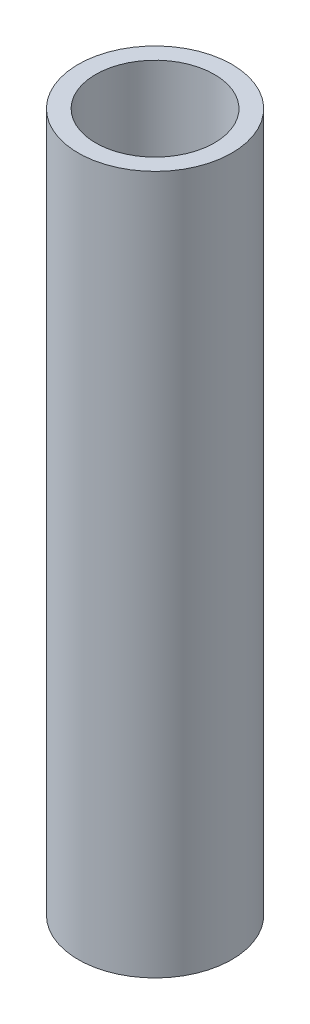
ISO-10303-21;
HEADER;
FILE_DESCRIPTION(('STEP AP214'),'2;1');
FILE_NAME('part.step','',(''),(''),'','','');
FILE_SCHEMA(('AUTOMOTIVE_DESIGN { 1 0 10303 214 1 1 1 1 }'));
ENDSEC;
DATA;
#1=APPLICATION_CONTEXT('core data for automotive mechanical design processes');
#2=APPLICATION_PROTOCOL_DEFINITION('international standard','automotive_design',2000,#1);
#3=PRODUCT_CONTEXT('',#1,'mechanical');
#4=PRODUCT('Part','Part','',(#3));
#5=PRODUCT_RELATED_PRODUCT_CATEGORY('part','',(#4));
#6=PRODUCT_DEFINITION_FORMATION('','',#4);
#7=PRODUCT_DEFINITION_CONTEXT('part definition',#1,'design');
#8=PRODUCT_DEFINITION('design','',#6,#7);
#9=PRODUCT_DEFINITION_SHAPE('','',#8);
#10=(LENGTH_UNIT() NAMED_UNIT(*) SI_UNIT(.MILLI.,.METRE.));
#11=(NAMED_UNIT(*) PLANE_ANGLE_UNIT() SI_UNIT($,.RADIAN.));
#12=(NAMED_UNIT(*) SI_UNIT($,.STERADIAN.) SOLID_ANGLE_UNIT());
#13=UNCERTAINTY_MEASURE_WITH_UNIT(LENGTH_MEASURE(1.E-05),#10,'distance_accuracy_value','');
#14=(GEOMETRIC_REPRESENTATION_CONTEXT(3) GLOBAL_UNCERTAINTY_ASSIGNED_CONTEXT((#13)) GLOBAL_UNIT_ASSIGNED_CONTEXT((#10,
#11,#12)) REPRESENTATION_CONTEXT('',''));
#15=CARTESIAN_POINT('',(0.,0.,0.));
#16=DIRECTION('',(0.,0.,1.));
#17=DIRECTION('',(1.,0.,0.));
#18=AXIS2_PLACEMENT_3D('',#15,#16,#17);
#19=CARTESIAN_POINT('',(0.,152.4,0.));
#20=DIRECTION('',(0.,1.,0.));
#21=DIRECTION('',(0.,0.,1.));
#22=AXIS2_PLACEMENT_3D('',#19,#20,#21);
#23=PLANE('',#22);
#24=CARTESIAN_POINT('',(0.,152.4,0.));
#25=DIRECTION('',(0.,1.,0.));
#26=DIRECTION('',(0.,0.,1.));
#27=AXIS2_PLACEMENT_3D('',#24,#25,#26);
#28=CIRCLE('',#27,16.764);
#29=CARTESIAN_POINT('',(0.,152.4,-16.764));
#30=VERTEX_POINT('',#29);
#31=EDGE_CURVE('E10',#30,#30,#28,.T.);
#32=ORIENTED_EDGE('',*,*,#31,.T.);
#33=EDGE_LOOP('',(#32));
#34=FACE_BOUND('',#33,.T.);
#35=CARTESIAN_POINT('',(0.,152.4,0.));
#36=DIRECTION('',(0.,1.,0.));
#37=DIRECTION('',(0.,0.,1.));
#38=AXIS2_PLACEMENT_3D('',#35,#36,#37);
#39=CIRCLE('',#38,12.954);
#40=CARTESIAN_POINT('',(0.,152.4,-12.954));
#41=VERTEX_POINT('',#40);
#42=EDGE_CURVE('E43',#41,#41,#39,.T.);
#43=ORIENTED_EDGE('',*,*,#42,.F.);
#44=EDGE_LOOP('',(#43));
#45=FACE_BOUND('',#44,.T.);
#46=ADVANCED_FACE('F32',(#34,#45),#23,.T.);
#47=CARTESIAN_POINT('',(0.,0.,0.));
#48=DIRECTION('',(0.,1.,0.));
#49=DIRECTION('',(0.,0.,1.));
#50=AXIS2_PLACEMENT_3D('',#47,#48,#49);
#51=PLANE('',#50);
#52=CARTESIAN_POINT('',(0.,0.,0.));
#53=DIRECTION('',(0.,1.,0.));
#54=DIRECTION('',(0.,0.,1.));
#55=AXIS2_PLACEMENT_3D('',#52,#53,#54);
#56=CIRCLE('',#55,16.764);
#57=CARTESIAN_POINT('',(0.,0.,-16.764));
#58=VERTEX_POINT('',#57);
#59=EDGE_CURVE('E36',#58,#58,#56,.T.);
#60=ORIENTED_EDGE('',*,*,#59,.F.);
#61=EDGE_LOOP('',(#60));
#62=FACE_BOUND('',#61,.T.);
#63=CARTESIAN_POINT('',(0.,0.,0.));
#64=DIRECTION('',(0.,1.,0.));
#65=DIRECTION('',(0.,0.,1.));
#66=AXIS2_PLACEMENT_3D('',#63,#64,#65);
#67=CIRCLE('',#66,12.954);
#68=CARTESIAN_POINT('',(0.,0.,-12.954));
#69=VERTEX_POINT('',#68);
#70=EDGE_CURVE('E45',#69,#69,#67,.T.);
#71=ORIENTED_EDGE('',*,*,#70,.T.);
#72=EDGE_LOOP('',(#71));
#73=FACE_BOUND('',#72,.T.);
#74=ADVANCED_FACE('F55',(#62,#73),#51,.F.);
#75=CARTESIAN_POINT('',(0.,152.4,0.));
#76=DIRECTION('',(0.,-1.,0.));
#77=DIRECTION('',(0.,0.,-1.));
#78=AXIS2_PLACEMENT_3D('',#75,#76,#77);
#79=CYLINDRICAL_SURFACE('',#78,16.764);
#80=CARTESIAN_POINT('',(0.,152.4,-16.764));
#81=CARTESIAN_POINT('',(0.,150.8125,-16.764));
#82=CARTESIAN_POINT('',(0.,149.225,-16.764));
#83=CARTESIAN_POINT('',(0.,146.05,-16.764));
#84=CARTESIAN_POINT('',(0.,144.4625,-16.764));
#85=CARTESIAN_POINT('',(0.,141.2875,-16.764));
#86=CARTESIAN_POINT('',(0.,139.7,-16.764));
#87=CARTESIAN_POINT('',(0.,136.525,-16.764));
#88=CARTESIAN_POINT('',(0.,134.9375,-16.764));
#89=CARTESIAN_POINT('',(0.,131.7625,-16.764));
#90=CARTESIAN_POINT('',(0.,130.175,-16.764));
#91=CARTESIAN_POINT('',(0.,127.,-16.764));
#92=CARTESIAN_POINT('',(0.,125.4125,-16.764));
#93=CARTESIAN_POINT('',(0.,122.2375,-16.764));
#94=CARTESIAN_POINT('',(0.,120.65,-16.764));
#95=CARTESIAN_POINT('',(0.,117.475,-16.764));
#96=CARTESIAN_POINT('',(0.,115.8875,-16.764));
#97=CARTESIAN_POINT('',(0.,112.7125,-16.764));
#98=CARTESIAN_POINT('',(0.,111.125,-16.764));
#99=CARTESIAN_POINT('',(0.,107.95,-16.764));
#100=CARTESIAN_POINT('',(0.,106.3625,-16.764));
#101=CARTESIAN_POINT('',(0.,103.1875,-16.764));
#102=CARTESIAN_POINT('',(0.,101.6,-16.764));
#103=CARTESIAN_POINT('',(0.,98.425,-16.764));
#104=CARTESIAN_POINT('',(0.,96.8375,-16.764));
#105=CARTESIAN_POINT('',(0.,93.6625,-16.764));
#106=CARTESIAN_POINT('',(0.,92.075,-16.764));
#107=CARTESIAN_POINT('',(0.,88.9,-16.764));
#108=CARTESIAN_POINT('',(0.,87.3125,-16.764));
#109=CARTESIAN_POINT('',(0.,84.1375,-16.764));
#110=CARTESIAN_POINT('',(0.,82.55,-16.764));
#111=CARTESIAN_POINT('',(0.,79.375,-16.764));
#112=CARTESIAN_POINT('',(0.,77.7875,-16.764));
#113=CARTESIAN_POINT('',(0.,74.6125,-16.764));
#114=CARTESIAN_POINT('',(0.,73.025,-16.764));
#115=CARTESIAN_POINT('',(0.,69.85,-16.764));
#116=CARTESIAN_POINT('',(0.,68.2625,-16.764));
#117=CARTESIAN_POINT('',(0.,65.0875,-16.764));
#118=CARTESIAN_POINT('',(0.,63.5,-16.764));
#119=CARTESIAN_POINT('',(0.,60.325,-16.764));
#120=CARTESIAN_POINT('',(0.,58.7375,-16.764));
#121=CARTESIAN_POINT('',(0.,55.5625,-16.764));
#122=CARTESIAN_POINT('',(0.,53.975,-16.764));
#123=CARTESIAN_POINT('',(0.,50.8,-16.764));
#124=CARTESIAN_POINT('',(0.,49.2125,-16.764));
#125=CARTESIAN_POINT('',(0.,46.0375,-16.764));
#126=CARTESIAN_POINT('',(0.,44.45,-16.764));
#127=CARTESIAN_POINT('',(0.,41.275,-16.764));
#128=CARTESIAN_POINT('',(0.,39.6875,-16.764));
#129=CARTESIAN_POINT('',(0.,36.5125,-16.764));
#130=CARTESIAN_POINT('',(0.,34.925,-16.764));
#131=CARTESIAN_POINT('',(0.,31.75,-16.764));
#132=CARTESIAN_POINT('',(0.,30.1625,-16.764));
#133=CARTESIAN_POINT('',(0.,26.9875,-16.764));
#134=CARTESIAN_POINT('',(0.,25.4,-16.764));
#135=CARTESIAN_POINT('',(0.,22.225,-16.764));
#136=CARTESIAN_POINT('',(0.,20.6375,-16.764));
#137=CARTESIAN_POINT('',(0.,17.4625,-16.764));
#138=CARTESIAN_POINT('',(0.,15.875,-16.764));
#139=CARTESIAN_POINT('',(0.,12.7,-16.764));
#140=CARTESIAN_POINT('',(0.,11.1125,-16.764));
#141=CARTESIAN_POINT('',(0.,7.93750000000001,-16.764));
#142=CARTESIAN_POINT('',(0.,6.35,-16.764));
#143=CARTESIAN_POINT('',(0.,3.175,-16.764));
#144=CARTESIAN_POINT('',(0.,1.5875,-16.764));
#145=CARTESIAN_POINT('',(0.,0.,-16.764));
#146=B_SPLINE_CURVE_WITH_KNOTS('',3,(#80,#81,#82,#83,#84,#85,#86,#87,#88,#89,#90,#91,#92,#93,
#94,#95,#96,#97,#98,#99,#100,#101,#102,#103,#104,#105,#106,#107,#108,#109,#110,#111,#112,#113,
#114,#115,#116,#117,#118,#119,#120,#121,#122,#123,#124,#125,#126,#127,#128,#129,#130,#131,#132,
#133,#134,#135,#136,#137,#138,#139,#140,#141,#142,#143,#144,#145),.UNSPECIFIED.,.F.,.F.,(4,2,2,
2,2,2,2,2,2,2,2,2,2,2,2,2,2,2,2,2,2,2,2,2,2,2,2,2,2,2,2,2,4),(0.,4.7625,9.52500000000001,
14.2875,19.05,23.8125,28.575,33.3375,38.1,42.8625,47.625,52.3875,57.15,61.9125,66.675,71.4375,
76.2,80.9625,85.725,90.4875,95.25,100.0125,104.775,109.5375,114.3,119.0625,123.825,128.5875,
133.35,138.1125,142.875,147.6375,152.4),.UNSPECIFIED.);
#147=EDGE_CURVE('BSEAM34',#30,#58,#146,.T.);
#148=ORIENTED_EDGE('',*,*,#31,.F.);
#149=ORIENTED_EDGE('',*,*,#59,.T.);
#150=ORIENTED_EDGE('',*,*,#147,.T.);
#151=ORIENTED_EDGE('',*,*,#147,.F.);
#152=EDGE_LOOP('',(#148,#150,#149,#151));
#153=FACE_BOUND('',#152,.T.);
#154=ADVANCED_FACE('F34',(#153),#79,.T.);
#155=CARTESIAN_POINT('',(0.,152.4,0.));
#156=DIRECTION('',(0.,-1.,0.));
#157=DIRECTION('',(0.,0.,-1.));
#158=AXIS2_PLACEMENT_3D('',#155,#156,#157);
#159=CYLINDRICAL_SURFACE('',#158,12.954);
#160=CARTESIAN_POINT('',(0.,152.4,-12.954));
#161=CARTESIAN_POINT('',(0.,150.8125,-12.954));
#162=CARTESIAN_POINT('',(0.,149.225,-12.954));
#163=CARTESIAN_POINT('',(0.,146.05,-12.954));
#164=CARTESIAN_POINT('',(0.,144.4625,-12.954));
#165=CARTESIAN_POINT('',(0.,141.2875,-12.954));
#166=CARTESIAN_POINT('',(0.,139.7,-12.954));
#167=CARTESIAN_POINT('',(0.,136.525,-12.954));
#168=CARTESIAN_POINT('',(0.,134.9375,-12.954));
#169=CARTESIAN_POINT('',(0.,131.7625,-12.954));
#170=CARTESIAN_POINT('',(0.,130.175,-12.954));
#171=CARTESIAN_POINT('',(0.,127.,-12.954));
#172=CARTESIAN_POINT('',(0.,125.4125,-12.954));
#173=CARTESIAN_POINT('',(0.,122.2375,-12.954));
#174=CARTESIAN_POINT('',(0.,120.65,-12.954));
#175=CARTESIAN_POINT('',(0.,117.475,-12.954));
#176=CARTESIAN_POINT('',(0.,115.8875,-12.954));
#177=CARTESIAN_POINT('',(0.,112.7125,-12.954));
#178=CARTESIAN_POINT('',(0.,111.125,-12.954));
#179=CARTESIAN_POINT('',(0.,107.95,-12.954));
#180=CARTESIAN_POINT('',(0.,106.3625,-12.954));
#181=CARTESIAN_POINT('',(0.,103.1875,-12.954));
#182=CARTESIAN_POINT('',(0.,101.6,-12.954));
#183=CARTESIAN_POINT('',(0.,98.425,-12.954));
#184=CARTESIAN_POINT('',(0.,96.8375,-12.954));
#185=CARTESIAN_POINT('',(0.,93.6625,-12.954));
#186=CARTESIAN_POINT('',(0.,92.075,-12.954));
#187=CARTESIAN_POINT('',(0.,88.9,-12.954));
#188=CARTESIAN_POINT('',(0.,87.3125,-12.954));
#189=CARTESIAN_POINT('',(0.,84.1375,-12.954));
#190=CARTESIAN_POINT('',(0.,82.55,-12.954));
#191=CARTESIAN_POINT('',(0.,79.375,-12.954));
#192=CARTESIAN_POINT('',(0.,77.7875,-12.954));
#193=CARTESIAN_POINT('',(0.,74.6125,-12.954));
#194=CARTESIAN_POINT('',(0.,73.025,-12.954));
#195=CARTESIAN_POINT('',(0.,69.85,-12.954));
#196=CARTESIAN_POINT('',(0.,68.2625,-12.954));
#197=CARTESIAN_POINT('',(0.,65.0875,-12.954));
#198=CARTESIAN_POINT('',(0.,63.5,-12.954));
#199=CARTESIAN_POINT('',(0.,60.325,-12.954));
#200=CARTESIAN_POINT('',(0.,58.7375,-12.954));
#201=CARTESIAN_POINT('',(0.,55.5625,-12.954));
#202=CARTESIAN_POINT('',(0.,53.975,-12.954));
#203=CARTESIAN_POINT('',(0.,50.8,-12.954));
#204=CARTESIAN_POINT('',(0.,49.2125,-12.954));
#205=CARTESIAN_POINT('',(0.,46.0375,-12.954));
#206=CARTESIAN_POINT('',(0.,44.45,-12.954));
#207=CARTESIAN_POINT('',(0.,41.275,-12.954));
#208=CARTESIAN_POINT('',(0.,39.6875,-12.954));
#209=CARTESIAN_POINT('',(0.,36.5125,-12.954));
#210=CARTESIAN_POINT('',(0.,34.925,-12.954));
#211=CARTESIAN_POINT('',(0.,31.75,-12.954));
#212=CARTESIAN_POINT('',(0.,30.1625,-12.954));
#213=CARTESIAN_POINT('',(0.,26.9875,-12.954));
#214=CARTESIAN_POINT('',(0.,25.4,-12.954));
#215=CARTESIAN_POINT('',(0.,22.225,-12.954));
#216=CARTESIAN_POINT('',(0.,20.6375,-12.954));
#217=CARTESIAN_POINT('',(0.,17.4625,-12.954));
#218=CARTESIAN_POINT('',(0.,15.875,-12.954));
#219=CARTESIAN_POINT('',(0.,12.7,-12.954));
#220=CARTESIAN_POINT('',(0.,11.1125,-12.954));
#221=CARTESIAN_POINT('',(0.,7.93750000000001,-12.954));
#222=CARTESIAN_POINT('',(0.,6.35,-12.954));
#223=CARTESIAN_POINT('',(0.,3.175,-12.954));
#224=CARTESIAN_POINT('',(0.,1.5875,-12.954));
#225=CARTESIAN_POINT('',(0.,0.,-12.954));
#226=B_SPLINE_CURVE_WITH_KNOTS('',3,(#160,#161,#162,#163,#164,#165,#166,#167,#168,#169,#170,
#171,#172,#173,#174,#175,#176,#177,#178,#179,#180,#181,#182,#183,#184,#185,#186,#187,#188,#189,
#190,#191,#192,#193,#194,#195,#196,#197,#198,#199,#200,#201,#202,#203,#204,#205,#206,#207,#208,
#209,#210,#211,#212,#213,#214,#215,#216,#217,#218,#219,#220,#221,#222,#223,#224,#225),
.UNSPECIFIED.,.F.,.F.,(4,2,2,2,2,2,2,2,2,2,2,2,2,2,2,2,2,2,2,2,2,2,2,2,2,2,2,2,2,2,2,2,4),(0.,
4.76249999999998,9.52499999999998,14.2875,19.05,23.8125,28.575,33.3375,38.1,42.8625,47.625,
52.3875,57.15,61.9125,66.675,71.4375,76.2,80.9625,85.725,90.4875,95.25,100.0125,104.775,
109.5375,114.3,119.0625,123.825,128.5875,133.35,138.1125,142.875,147.6375,152.4),.UNSPECIFIED.);
#227=EDGE_CURVE('BSEAM51',#41,#69,#226,.T.);
#228=ORIENTED_EDGE('',*,*,#42,.T.);
#229=ORIENTED_EDGE('',*,*,#70,.F.);
#230=ORIENTED_EDGE('',*,*,#227,.T.);
#231=ORIENTED_EDGE('',*,*,#227,.F.);
#232=EDGE_LOOP('',(#228,#230,#229,#231));
#233=FACE_BOUND('',#232,.T.);
#234=ADVANCED_FACE('F51',(#233),#159,.F.);
#235=CLOSED_SHELL('',(#46,#74,#154,#234));
#236=MANIFOLD_SOLID_BREP('B2',#235);
#237=ADVANCED_BREP_SHAPE_REPRESENTATION('',(#18,#236),#14);
#238=SHAPE_DEFINITION_REPRESENTATION(#9,#237);
ENDSEC;
END-ISO-10303-21;
